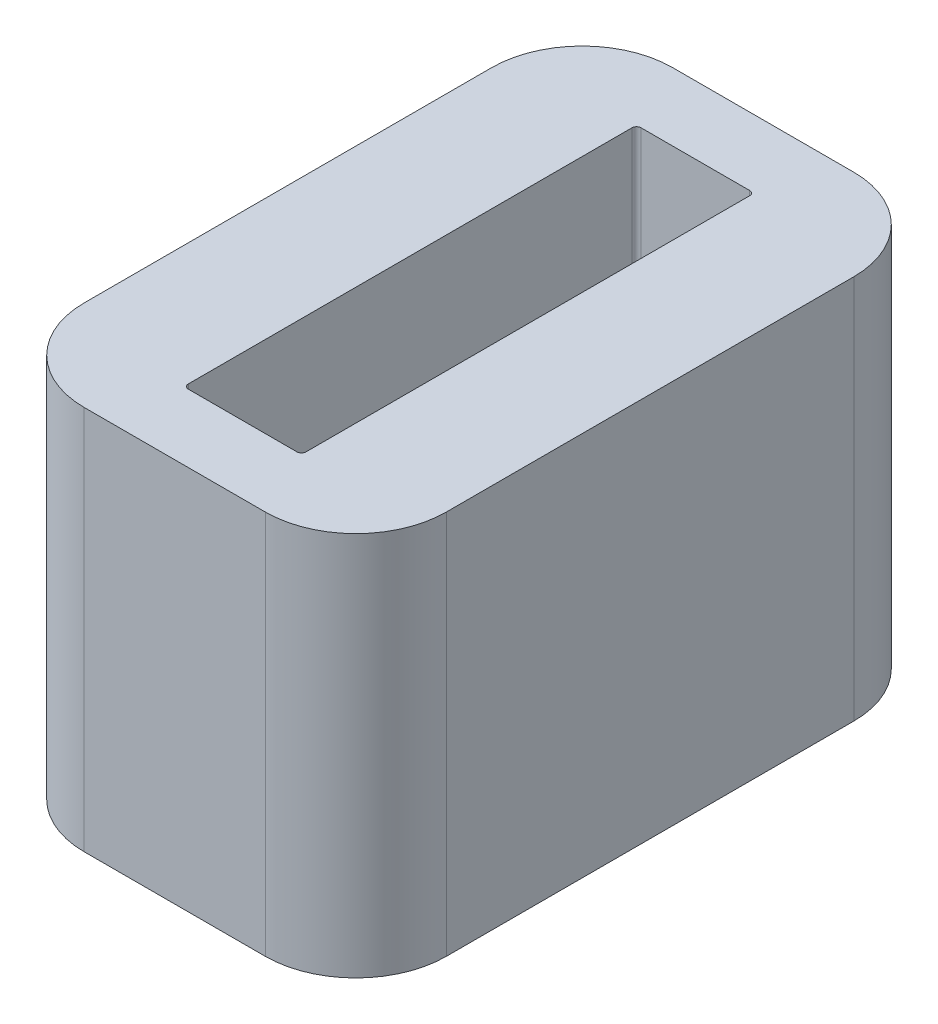
ISO-10303-21;
HEADER;
FILE_DESCRIPTION(('STEP AP214'),'2;1');
FILE_NAME('part.step','',(''),(''),'','','');
FILE_SCHEMA(('AUTOMOTIVE_DESIGN { 1 0 10303 214 1 1 1 1 }'));
ENDSEC;
DATA;
#1=APPLICATION_CONTEXT('core data for automotive mechanical design processes');
#2=APPLICATION_PROTOCOL_DEFINITION('international standard','automotive_design',2000,#1);
#3=PRODUCT_CONTEXT('',#1,'mechanical');
#4=PRODUCT('Part','Part','',(#3));
#5=PRODUCT_RELATED_PRODUCT_CATEGORY('part','',(#4));
#6=PRODUCT_DEFINITION_FORMATION('','',#4);
#7=PRODUCT_DEFINITION_CONTEXT('part definition',#1,'design');
#8=PRODUCT_DEFINITION('design','',#6,#7);
#9=PRODUCT_DEFINITION_SHAPE('','',#8);
#10=(LENGTH_UNIT() NAMED_UNIT(*) SI_UNIT(.MILLI.,.METRE.));
#11=(NAMED_UNIT(*) PLANE_ANGLE_UNIT() SI_UNIT($,.RADIAN.));
#12=(NAMED_UNIT(*) SI_UNIT($,.STERADIAN.) SOLID_ANGLE_UNIT());
#13=UNCERTAINTY_MEASURE_WITH_UNIT(LENGTH_MEASURE(1.E-05),#10,'distance_accuracy_value','');
#14=(GEOMETRIC_REPRESENTATION_CONTEXT(3) GLOBAL_UNCERTAINTY_ASSIGNED_CONTEXT((#13)) GLOBAL_UNIT_ASSIGNED_CONTEXT((#10,
#11,#12)) REPRESENTATION_CONTEXT('',''));
#15=CARTESIAN_POINT('',(0.,0.,0.));
#16=DIRECTION('',(0.,0.,1.));
#17=DIRECTION('',(1.,0.,0.));
#18=AXIS2_PLACEMENT_3D('',#15,#16,#17);
#19=CARTESIAN_POINT('',(87.0727928211845,88.0794752893805,-74.6093677585195));
#20=DIRECTION('',(0.,1.,0.));
#21=DIRECTION('',(0.,0.,1.));
#22=AXIS2_PLACEMENT_3D('',#19,#20,#21);
#23=CYLINDRICAL_SURFACE('',#22,2.);
#24=CARTESIAN_POINT('',(87.0727928211845,96.5794752893805,-74.6093677585195));
#25=DIRECTION('',(0.,1.,0.));
#26=DIRECTION('',(0.,0.,-1.));
#27=AXIS2_PLACEMENT_3D('',#24,#25,#26);
#28=CIRCLE('',#27,2.);
#29=CARTESIAN_POINT('',(85.0727928211845,96.5794752893805,-74.6093677585195));
#30=VERTEX_POINT('',#29);
#31=CARTESIAN_POINT('',(87.0727928211845,96.5794752893805,-72.6093677585195));
#32=VERTEX_POINT('',#31);
#33=EDGE_CURVE('E219',#30,#32,#28,.T.);
#34=ORIENTED_EDGE('',*,*,#33,.F.);
#35=DIRECTION('',(0.,1.,0.));
#36=VECTOR('',#35,1.);
#37=CARTESIAN_POINT('',(85.0727928211845,88.0794752893805,-74.6093677585195));
#38=LINE('',#37,#36);
#39=CARTESIAN_POINT('',(85.0727928211845,88.0794752893805,-74.6093677585195));
#40=VERTEX_POINT('',#39);
#41=EDGE_CURVE('E194',#40,#30,#38,.T.);
#42=ORIENTED_EDGE('',*,*,#41,.F.);
#43=CARTESIAN_POINT('',(87.0727928211845,88.0794752893805,-74.6093677585195));
#44=DIRECTION('',(0.,1.,0.));
#45=DIRECTION('',(0.,0.,-1.));
#46=AXIS2_PLACEMENT_3D('',#43,#44,#45);
#47=CIRCLE('',#46,2.);
#48=CARTESIAN_POINT('',(87.0727928211845,88.0794752893805,-72.6093677585195));
#49=VERTEX_POINT('',#48);
#50=EDGE_CURVE('E188',#40,#49,#47,.T.);
#51=ORIENTED_EDGE('',*,*,#50,.T.);
#52=DIRECTION('',(0.,1.,0.));
#53=VECTOR('',#52,1.);
#54=CARTESIAN_POINT('',(87.0727928211845,88.0794752893805,-72.6093677585195));
#55=LINE('',#54,#53);
#56=EDGE_CURVE('E170',#49,#32,#55,.T.);
#57=ORIENTED_EDGE('',*,*,#56,.T.);
#58=EDGE_LOOP('',(#34,#42,#51,#57));
#59=FACE_BOUND('',#58,.T.);
#60=ADVANCED_FACE('F43',(#59),#23,.T.);
#61=CARTESIAN_POINT('',(85.0727928211845,88.0794752893805,-74.6093677585195));
#62=DIRECTION('',(-1.,0.,0.));
#63=DIRECTION('',(0.,0.,1.));
#64=AXIS2_PLACEMENT_3D('',#61,#62,#63);
#65=PLANE('',#64);
#66=DIRECTION('',(0.,0.,1.));
#67=VECTOR('',#66,1.);
#68=CARTESIAN_POINT('',(85.0727928211845,96.5794752893805,-74.6093677585195));
#69=LINE('',#68,#67);
#70=CARTESIAN_POINT('',(85.0727928211845,96.5794752893805,-83.6093677585195));
#71=VERTEX_POINT('',#70);
#72=EDGE_CURVE('E195',#71,#30,#69,.T.);
#73=ORIENTED_EDGE('',*,*,#72,.F.);
#74=DIRECTION('',(0.,1.,0.));
#75=VECTOR('',#74,1.);
#76=CARTESIAN_POINT('',(85.0727928211845,88.0794752893805,-83.6093677585195));
#77=LINE('',#76,#75);
#78=CARTESIAN_POINT('',(85.0727928211845,88.0794752893805,-83.6093677585195));
#79=VERTEX_POINT('',#78);
#80=EDGE_CURVE('E244',#79,#71,#77,.T.);
#81=ORIENTED_EDGE('',*,*,#80,.F.);
#82=DIRECTION('',(0.,0.,1.));
#83=VECTOR('',#82,1.);
#84=CARTESIAN_POINT('',(85.0727928211845,88.0794752893805,-74.6093677585195));
#85=LINE('',#84,#83);
#86=EDGE_CURVE('E181',#79,#40,#85,.T.);
#87=ORIENTED_EDGE('',*,*,#86,.T.);
#88=ORIENTED_EDGE('',*,*,#41,.T.);
#89=EDGE_LOOP('',(#73,#81,#87,#88));
#90=FACE_BOUND('',#89,.T.);
#91=ADVANCED_FACE('F366',(#90),#65,.T.);
#92=CARTESIAN_POINT('',(87.0727928211845,88.0794752893805,-83.6093677585195));
#93=DIRECTION('',(0.,1.,0.));
#94=DIRECTION('',(0.,0.,1.));
#95=AXIS2_PLACEMENT_3D('',#92,#93,#94);
#96=CYLINDRICAL_SURFACE('',#95,2.00000000000001);
#97=CARTESIAN_POINT('',(87.0727928211845,96.5794752893805,-83.6093677585195));
#98=DIRECTION('',(0.,1.,0.));
#99=DIRECTION('',(0.,0.,-1.));
#100=AXIS2_PLACEMENT_3D('',#97,#98,#99);
#101=CIRCLE('',#100,2.00000000000001);
#102=CARTESIAN_POINT('',(87.0727928211845,96.5794752893805,-85.6093677585195));
#103=VERTEX_POINT('',#102);
#104=EDGE_CURVE('E199',#103,#71,#101,.T.);
#105=ORIENTED_EDGE('',*,*,#104,.F.);
#106=DIRECTION('',(0.,1.,0.));
#107=VECTOR('',#106,1.);
#108=CARTESIAN_POINT('',(87.0727928211845,88.0794752893805,-85.6093677585195));
#109=LINE('',#108,#107);
#110=CARTESIAN_POINT('',(87.0727928211845,88.0794752893805,-85.6093677585195));
#111=VERTEX_POINT('',#110);
#112=EDGE_CURVE('E247',#111,#103,#109,.T.);
#113=ORIENTED_EDGE('',*,*,#112,.F.);
#114=CARTESIAN_POINT('',(87.0727928211845,88.0794752893805,-83.6093677585195));
#115=DIRECTION('',(0.,1.,0.));
#116=DIRECTION('',(0.,0.,-1.));
#117=AXIS2_PLACEMENT_3D('',#114,#115,#116);
#118=CIRCLE('',#117,2.00000000000001);
#119=EDGE_CURVE('E215',#111,#79,#118,.T.);
#120=ORIENTED_EDGE('',*,*,#119,.T.);
#121=ORIENTED_EDGE('',*,*,#80,.T.);
#122=EDGE_LOOP('',(#105,#113,#120,#121));
#123=FACE_BOUND('',#122,.T.);
#124=ADVANCED_FACE('F371',(#123),#96,.T.);
#125=CARTESIAN_POINT('',(87.0727928211845,88.0794752893805,-85.6093677585195));
#126=DIRECTION('',(0.,0.,-1.));
#127=DIRECTION('',(-1.,0.,0.));
#128=AXIS2_PLACEMENT_3D('',#125,#126,#127);
#129=PLANE('',#128);
#130=DIRECTION('',(-1.,0.,0.));
#131=VECTOR('',#130,1.);
#132=CARTESIAN_POINT('',(87.0727928211845,96.5794752893805,-85.6093677585195));
#133=LINE('',#132,#131);
#134=CARTESIAN_POINT('',(91.0727928211845,96.5794752893805,-85.6093677585195));
#135=VERTEX_POINT('',#134);
#136=EDGE_CURVE('E235',#135,#103,#133,.T.);
#137=ORIENTED_EDGE('',*,*,#136,.F.);
#138=DIRECTION('',(0.,1.,0.));
#139=VECTOR('',#138,1.);
#140=CARTESIAN_POINT('',(91.0727928211845,88.0794752893805,-85.6093677585195));
#141=LINE('',#140,#139);
#142=CARTESIAN_POINT('',(91.0727928211845,88.0794752893805,-85.6093677585195));
#143=VERTEX_POINT('',#142);
#144=EDGE_CURVE('E250',#143,#135,#141,.T.);
#145=ORIENTED_EDGE('',*,*,#144,.F.);
#146=DIRECTION('',(-1.,0.,0.));
#147=VECTOR('',#146,1.);
#148=CARTESIAN_POINT('',(87.0727928211845,88.0794752893805,-85.6093677585195));
#149=LINE('',#148,#147);
#150=EDGE_CURVE('E212',#143,#111,#149,.T.);
#151=ORIENTED_EDGE('',*,*,#150,.T.);
#152=ORIENTED_EDGE('',*,*,#112,.T.);
#153=EDGE_LOOP('',(#137,#145,#151,#152));
#154=FACE_BOUND('',#153,.T.);
#155=ADVANCED_FACE('F479',(#154),#129,.T.);
#156=CARTESIAN_POINT('',(91.0727928211845,88.0794752893805,-83.6093677585195));
#157=DIRECTION('',(0.,1.,0.));
#158=DIRECTION('',(0.,0.,1.));
#159=AXIS2_PLACEMENT_3D('',#156,#157,#158);
#160=CYLINDRICAL_SURFACE('',#159,2.00000000000001);
#161=CARTESIAN_POINT('',(91.0727928211845,96.5794752893805,-83.6093677585195));
#162=DIRECTION('',(0.,1.,0.));
#163=DIRECTION('',(0.,0.,-1.));
#164=AXIS2_PLACEMENT_3D('',#161,#162,#163);
#165=CIRCLE('',#164,2.00000000000001);
#166=CARTESIAN_POINT('',(93.0727928211845,96.5794752893805,-83.6093677585195));
#167=VERTEX_POINT('',#166);
#168=EDGE_CURVE('E231',#167,#135,#165,.T.);
#169=ORIENTED_EDGE('',*,*,#168,.F.);
#170=DIRECTION('',(0.,1.,0.));
#171=VECTOR('',#170,1.);
#172=CARTESIAN_POINT('',(93.0727928211845,88.0794752893805,-83.6093677585195));
#173=LINE('',#172,#171);
#174=CARTESIAN_POINT('',(93.0727928211845,88.0794752893805,-83.6093677585195));
#175=VERTEX_POINT('',#174);
#176=EDGE_CURVE('E253',#175,#167,#173,.T.);
#177=ORIENTED_EDGE('',*,*,#176,.F.);
#178=CARTESIAN_POINT('',(91.0727928211845,88.0794752893805,-83.6093677585195));
#179=DIRECTION('',(0.,1.,0.));
#180=DIRECTION('',(0.,0.,-1.));
#181=AXIS2_PLACEMENT_3D('',#178,#179,#180);
#182=CIRCLE('',#181,2.00000000000001);
#183=EDGE_CURVE('E209',#175,#143,#182,.T.);
#184=ORIENTED_EDGE('',*,*,#183,.T.);
#185=ORIENTED_EDGE('',*,*,#144,.T.);
#186=EDGE_LOOP('',(#169,#177,#184,#185));
#187=FACE_BOUND('',#186,.T.);
#188=ADVANCED_FACE('F469',(#187),#160,.T.);
#189=CARTESIAN_POINT('',(93.0727928211845,88.0794752893805,-74.6093677585195));
#190=DIRECTION('',(1.,0.,0.));
#191=DIRECTION('',(0.,0.,-1.));
#192=AXIS2_PLACEMENT_3D('',#189,#190,#191);
#193=PLANE('',#192);
#194=DIRECTION('',(0.,0.,-1.));
#195=VECTOR('',#194,1.);
#196=CARTESIAN_POINT('',(93.0727928211845,96.5794752893805,-74.6093677585195));
#197=LINE('',#196,#195);
#198=CARTESIAN_POINT('',(93.0727928211845,96.5794752893805,-74.6093677585195));
#199=VERTEX_POINT('',#198);
#200=EDGE_CURVE('E227',#199,#167,#197,.T.);
#201=ORIENTED_EDGE('',*,*,#200,.F.);
#202=DIRECTION('',(0.,1.,0.));
#203=VECTOR('',#202,1.);
#204=CARTESIAN_POINT('',(93.0727928211845,88.0794752893805,-74.6093677585195));
#205=LINE('',#204,#203);
#206=CARTESIAN_POINT('',(93.0727928211845,88.0794752893805,-74.6093677585195));
#207=VERTEX_POINT('',#206);
#208=EDGE_CURVE('E256',#207,#199,#205,.T.);
#209=ORIENTED_EDGE('',*,*,#208,.F.);
#210=DIRECTION('',(0.,0.,-1.));
#211=VECTOR('',#210,1.);
#212=CARTESIAN_POINT('',(93.0727928211845,88.0794752893805,-74.6093677585195));
#213=LINE('',#212,#211);
#214=EDGE_CURVE('E206',#207,#175,#213,.T.);
#215=ORIENTED_EDGE('',*,*,#214,.T.);
#216=ORIENTED_EDGE('',*,*,#176,.T.);
#217=EDGE_LOOP('',(#201,#209,#215,#216));
#218=FACE_BOUND('',#217,.T.);
#219=ADVANCED_FACE('F460',(#218),#193,.T.);
#220=CARTESIAN_POINT('',(91.0727928211845,88.0794752893805,-74.6093677585195));
#221=DIRECTION('',(0.,1.,0.));
#222=DIRECTION('',(0.,0.,1.));
#223=AXIS2_PLACEMENT_3D('',#220,#221,#222);
#224=CYLINDRICAL_SURFACE('',#223,2.);
#225=CARTESIAN_POINT('',(91.0727928211845,96.5794752893805,-74.6093677585195));
#226=DIRECTION('',(0.,1.,0.));
#227=DIRECTION('',(0.,0.,1.));
#228=AXIS2_PLACEMENT_3D('',#225,#226,#227);
#229=CIRCLE('',#228,2.);
#230=CARTESIAN_POINT('',(91.0727928211845,96.5794752893805,-72.6093677585195));
#231=VERTEX_POINT('',#230);
#232=EDGE_CURVE('E223',#231,#199,#229,.T.);
#233=ORIENTED_EDGE('',*,*,#232,.F.);
#234=DIRECTION('',(0.,1.,0.));
#235=VECTOR('',#234,1.);
#236=CARTESIAN_POINT('',(91.0727928211845,88.0794752893805,-72.6093677585195));
#237=LINE('',#236,#235);
#238=CARTESIAN_POINT('',(91.0727928211845,88.0794752893805,-72.6093677585195));
#239=VERTEX_POINT('',#238);
#240=EDGE_CURVE('E180',#239,#231,#237,.T.);
#241=ORIENTED_EDGE('',*,*,#240,.F.);
#242=CARTESIAN_POINT('',(91.0727928211845,88.0794752893805,-74.6093677585195));
#243=DIRECTION('',(0.,1.,0.));
#244=DIRECTION('',(0.,0.,1.));
#245=AXIS2_PLACEMENT_3D('',#242,#243,#244);
#246=CIRCLE('',#245,2.);
#247=EDGE_CURVE('E192',#239,#207,#246,.T.);
#248=ORIENTED_EDGE('',*,*,#247,.T.);
#249=ORIENTED_EDGE('',*,*,#208,.T.);
#250=EDGE_LOOP('',(#233,#241,#248,#249));
#251=FACE_BOUND('',#250,.T.);
#252=ADVANCED_FACE('F452',(#251),#224,.T.);
#253=CARTESIAN_POINT('',(87.0727928211845,88.0794752893805,-72.6093677585195));
#254=DIRECTION('',(0.,0.,1.));
#255=DIRECTION('',(1.,0.,0.));
#256=AXIS2_PLACEMENT_3D('',#253,#254,#255);
#257=PLANE('',#256);
#258=DIRECTION('',(1.,0.,0.));
#259=VECTOR('',#258,1.);
#260=CARTESIAN_POINT('',(87.0727928211845,96.5794752893805,-72.6093677585195));
#261=LINE('',#260,#259);
#262=EDGE_CURVE('E175',#32,#231,#261,.T.);
#263=ORIENTED_EDGE('',*,*,#262,.F.);
#264=ORIENTED_EDGE('',*,*,#56,.F.);
#265=DIRECTION('',(1.,0.,0.));
#266=VECTOR('',#265,1.);
#267=CARTESIAN_POINT('',(87.0727928211845,88.0794752893805,-72.6093677585195));
#268=LINE('',#267,#266);
#269=EDGE_CURVE('E173',#49,#239,#268,.T.);
#270=ORIENTED_EDGE('',*,*,#269,.T.);
#271=ORIENTED_EDGE('',*,*,#240,.T.);
#272=EDGE_LOOP('',(#263,#264,#270,#271));
#273=FACE_BOUND('',#272,.T.);
#274=ADVANCED_FACE('F172',(#273),#257,.T.);
#275=CARTESIAN_POINT('',(87.0727928211845,88.0794752893805,-74.6093677585195));
#276=DIRECTION('',(0.,-1.,0.));
#277=DIRECTION('',(0.,0.,-1.));
#278=AXIS2_PLACEMENT_3D('',#275,#276,#277);
#279=PLANE('',#278);
#280=DIRECTION('',(1.,0.,0.));
#281=VECTOR('',#280,1.);
#282=CARTESIAN_POINT('',(87.7727928211845,88.0794752893805,-74.1093677585195));
#283=LINE('',#282,#281);
#284=CARTESIAN_POINT('',(87.8727928211845,88.0794752893805,-74.1093677585195));
#285=VERTEX_POINT('',#284);
#286=CARTESIAN_POINT('',(90.2727928211845,88.0794752893805,-74.1093677585195));
#287=VERTEX_POINT('',#286);
#288=EDGE_CURVE('E221',#285,#287,#283,.T.);
#289=ORIENTED_EDGE('',*,*,#288,.T.);
#290=CARTESIAN_POINT('',(90.2727928211845,88.0794752893805,-74.2093677585195));
#291=DIRECTION('',(0.,-1.,0.));
#292=DIRECTION('',(0.,0.,-1.));
#293=AXIS2_PLACEMENT_3D('',#290,#291,#292);
#294=CIRCLE('',#293,0.1);
#295=CARTESIAN_POINT('',(90.3727928211845,88.0794752893805,-74.2093677585195));
#296=VERTEX_POINT('',#295);
#297=EDGE_CURVE('E290',#287,#296,#294,.F.);
#298=ORIENTED_EDGE('',*,*,#297,.T.);
#299=DIRECTION('',(0.,0.,-1.));
#300=VECTOR('',#299,1.);
#301=CARTESIAN_POINT('',(90.3727928211845,88.0794752893805,-74.1093677585195));
#302=LINE('',#301,#300);
#303=CARTESIAN_POINT('',(90.3727928211845,88.0794752893805,-84.0093677585195));
#304=VERTEX_POINT('',#303);
#305=EDGE_CURVE('E323',#296,#304,#302,.T.);
#306=ORIENTED_EDGE('',*,*,#305,.T.);
#307=CARTESIAN_POINT('',(90.2727928211845,88.0794752893805,-84.0093677585195));
#308=DIRECTION('',(0.,-1.,0.));
#309=DIRECTION('',(0.,0.,-1.));
#310=AXIS2_PLACEMENT_3D('',#307,#308,#309);
#311=CIRCLE('',#310,0.1);
#312=CARTESIAN_POINT('',(90.2727928211845,88.0794752893805,-84.1093677585195));
#313=VERTEX_POINT('',#312);
#314=EDGE_CURVE('E11',#304,#313,#311,.F.);
#315=ORIENTED_EDGE('',*,*,#314,.T.);
#316=DIRECTION('',(-1.,0.,0.));
#317=VECTOR('',#316,1.);
#318=CARTESIAN_POINT('',(87.7727928211845,88.0794752893805,-84.1093677585195));
#319=LINE('',#318,#317);
#320=CARTESIAN_POINT('',(87.8727928211845,88.0794752893805,-84.1093677585195));
#321=VERTEX_POINT('',#320);
#322=EDGE_CURVE('E320',#313,#321,#319,.T.);
#323=ORIENTED_EDGE('',*,*,#322,.T.);
#324=CARTESIAN_POINT('',(87.8727928211845,88.0794752893805,-84.0093677585195));
#325=DIRECTION('',(0.,-1.,0.));
#326=DIRECTION('',(0.,0.,-1.));
#327=AXIS2_PLACEMENT_3D('',#324,#325,#326);
#328=CIRCLE('',#327,0.1);
#329=CARTESIAN_POINT('',(87.7727928211845,88.0794752893805,-84.0093677585195));
#330=VERTEX_POINT('',#329);
#331=EDGE_CURVE('E300',#321,#330,#328,.F.);
#332=ORIENTED_EDGE('',*,*,#331,.T.);
#333=DIRECTION('',(0.,0.,1.));
#334=VECTOR('',#333,1.);
#335=CARTESIAN_POINT('',(87.7727928211845,88.0794752893805,-74.1093677585195));
#336=LINE('',#335,#334);
#337=CARTESIAN_POINT('',(87.7727928211845,88.0794752893805,-74.2093677585195));
#338=VERTEX_POINT('',#337);
#339=EDGE_CURVE('E322',#330,#338,#336,.T.);
#340=ORIENTED_EDGE('',*,*,#339,.T.);
#341=CARTESIAN_POINT('',(87.8727928211845,88.0794752893805,-74.2093677585195));
#342=DIRECTION('',(0.,-1.,0.));
#343=DIRECTION('',(0.,0.,-1.));
#344=AXIS2_PLACEMENT_3D('',#341,#342,#343);
#345=CIRCLE('',#344,0.1);
#346=EDGE_CURVE('E295',#338,#285,#345,.F.);
#347=ORIENTED_EDGE('',*,*,#346,.T.);
#348=EDGE_LOOP('',(#289,#298,#306,#315,#323,#332,#340,#347));
#349=FACE_BOUND('',#348,.T.);
#350=ORIENTED_EDGE('',*,*,#50,.F.);
#351=ORIENTED_EDGE('',*,*,#86,.F.);
#352=ORIENTED_EDGE('',*,*,#119,.F.);
#353=ORIENTED_EDGE('',*,*,#150,.F.);
#354=ORIENTED_EDGE('',*,*,#183,.F.);
#355=ORIENTED_EDGE('',*,*,#214,.F.);
#356=ORIENTED_EDGE('',*,*,#247,.F.);
#357=ORIENTED_EDGE('',*,*,#269,.F.);
#358=EDGE_LOOP('',(#350,#351,#352,#353,#354,#355,#356,#357));
#359=FACE_BOUND('',#358,.T.);
#360=ADVANCED_FACE('F186',(#349,#359),#279,.T.);
#361=CARTESIAN_POINT('',(87.0727928211845,96.5794752893805,-74.6093677585195));
#362=DIRECTION('',(0.,-1.,0.));
#363=DIRECTION('',(0.,0.,-1.));
#364=AXIS2_PLACEMENT_3D('',#361,#362,#363);
#365=PLANE('',#364);
#366=DIRECTION('',(-1.,0.,0.));
#367=VECTOR('',#366,1.);
#368=CARTESIAN_POINT('',(87.7727928211845,96.5794752893805,-84.1093677585195));
#369=LINE('',#368,#367);
#370=CARTESIAN_POINT('',(90.2727928211845,96.5794752893805,-84.1093677585195));
#371=VERTEX_POINT('',#370);
#372=CARTESIAN_POINT('',(87.8727928211845,96.5794752893805,-84.1093677585195));
#373=VERTEX_POINT('',#372);
#374=EDGE_CURVE('E309',#371,#373,#369,.T.);
#375=ORIENTED_EDGE('',*,*,#374,.F.);
#376=CARTESIAN_POINT('',(90.2727928211845,96.5794752893805,-84.0093677585195));
#377=DIRECTION('',(0.,-1.,0.));
#378=DIRECTION('',(0.,0.,-1.));
#379=AXIS2_PLACEMENT_3D('',#376,#377,#378);
#380=CIRCLE('',#379,0.1);
#381=CARTESIAN_POINT('',(90.3727928211845,96.5794752893805,-84.0093677585195));
#382=VERTEX_POINT('',#381);
#383=EDGE_CURVE('E51',#371,#382,#380,.T.);
#384=ORIENTED_EDGE('',*,*,#383,.T.);
#385=DIRECTION('',(0.,0.,-1.));
#386=VECTOR('',#385,1.);
#387=CARTESIAN_POINT('',(90.3727928211845,96.5794752893805,-74.1093677585195));
#388=LINE('',#387,#386);
#389=CARTESIAN_POINT('',(90.3727928211845,96.5794752893805,-74.2093677585195));
#390=VERTEX_POINT('',#389);
#391=EDGE_CURVE('E308',#390,#382,#388,.T.);
#392=ORIENTED_EDGE('',*,*,#391,.F.);
#393=CARTESIAN_POINT('',(90.2727928211845,96.5794752893805,-74.2093677585195));
#394=DIRECTION('',(0.,-1.,0.));
#395=DIRECTION('',(0.,0.,-1.));
#396=AXIS2_PLACEMENT_3D('',#393,#394,#395);
#397=CIRCLE('',#396,0.1);
#398=CARTESIAN_POINT('',(90.2727928211845,96.5794752893805,-74.1093677585195));
#399=VERTEX_POINT('',#398);
#400=EDGE_CURVE('E287',#390,#399,#397,.T.);
#401=ORIENTED_EDGE('',*,*,#400,.T.);
#402=DIRECTION('',(1.,0.,0.));
#403=VECTOR('',#402,1.);
#404=CARTESIAN_POINT('',(87.7727928211845,96.5794752893805,-74.1093677585195));
#405=LINE('',#404,#403);
#406=CARTESIAN_POINT('',(87.8727928211845,96.5794752893805,-74.1093677585195));
#407=VERTEX_POINT('',#406);
#408=EDGE_CURVE('E202',#407,#399,#405,.T.);
#409=ORIENTED_EDGE('',*,*,#408,.F.);
#410=CARTESIAN_POINT('',(87.8727928211845,96.5794752893805,-74.2093677585195));
#411=DIRECTION('',(0.,-1.,0.));
#412=DIRECTION('',(0.,0.,-1.));
#413=AXIS2_PLACEMENT_3D('',#410,#411,#412);
#414=CIRCLE('',#413,0.1);
#415=CARTESIAN_POINT('',(87.7727928211845,96.5794752893805,-74.2093677585195));
#416=VERTEX_POINT('',#415);
#417=EDGE_CURVE('E292',#407,#416,#414,.T.);
#418=ORIENTED_EDGE('',*,*,#417,.T.);
#419=DIRECTION('',(0.,0.,1.));
#420=VECTOR('',#419,1.);
#421=CARTESIAN_POINT('',(87.7727928211845,96.5794752893805,-74.1093677585195));
#422=LINE('',#421,#420);
#423=CARTESIAN_POINT('',(87.7727928211845,96.5794752893805,-84.0093677585195));
#424=VERTEX_POINT('',#423);
#425=EDGE_CURVE('E332',#424,#416,#422,.T.);
#426=ORIENTED_EDGE('',*,*,#425,.F.);
#427=CARTESIAN_POINT('',(87.8727928211845,96.5794752893805,-84.0093677585195));
#428=DIRECTION('',(0.,-1.,0.));
#429=DIRECTION('',(0.,0.,-1.));
#430=AXIS2_PLACEMENT_3D('',#427,#428,#429);
#431=CIRCLE('',#430,0.1);
#432=EDGE_CURVE('E297',#424,#373,#431,.T.);
#433=ORIENTED_EDGE('',*,*,#432,.T.);
#434=EDGE_LOOP('',(#375,#384,#392,#401,#409,#418,#426,#433));
#435=FACE_BOUND('',#434,.T.);
#436=ORIENTED_EDGE('',*,*,#33,.T.);
#437=ORIENTED_EDGE('',*,*,#262,.T.);
#438=ORIENTED_EDGE('',*,*,#232,.T.);
#439=ORIENTED_EDGE('',*,*,#200,.T.);
#440=ORIENTED_EDGE('',*,*,#168,.T.);
#441=ORIENTED_EDGE('',*,*,#136,.T.);
#442=ORIENTED_EDGE('',*,*,#104,.T.);
#443=ORIENTED_EDGE('',*,*,#72,.T.);
#444=EDGE_LOOP('',(#436,#437,#438,#439,#440,#441,#442,#443));
#445=FACE_BOUND('',#444,.T.);
#446=ADVANCED_FACE('F306',(#435,#445),#365,.F.);
#447=CARTESIAN_POINT('',(90.3727928211845,88.0794752893805,-74.1093677585195));
#448=DIRECTION('',(1.,0.,0.));
#449=DIRECTION('',(0.,0.,-1.));
#450=AXIS2_PLACEMENT_3D('',#447,#448,#449);
#451=PLANE('',#450);
#452=ORIENTED_EDGE('',*,*,#305,.F.);
#453=DIRECTION('',(0.,1.,0.));
#454=VECTOR('',#453,1.);
#455=CARTESIAN_POINT('',(90.3727928211845,96.5794752893805,-74.2093677585195));
#456=LINE('',#455,#454);
#457=EDGE_CURVE('E263',#296,#390,#456,.T.);
#458=ORIENTED_EDGE('',*,*,#457,.T.);
#459=ORIENTED_EDGE('',*,*,#391,.T.);
#460=DIRECTION('',(0.,1.,0.));
#461=VECTOR('',#460,1.);
#462=CARTESIAN_POINT('',(90.3727928211845,88.0794752893805,-84.0093677585195));
#463=LINE('',#462,#461);
#464=EDGE_CURVE('E243',#382,#304,#463,.F.);
#465=ORIENTED_EDGE('',*,*,#464,.T.);
#466=EDGE_LOOP('',(#452,#458,#459,#465));
#467=FACE_BOUND('',#466,.T.);
#468=ADVANCED_FACE('F315',(#467),#451,.F.);
#469=CARTESIAN_POINT('',(87.7727928211845,88.0794752893805,-74.1093677585195));
#470=DIRECTION('',(0.,0.,1.));
#471=DIRECTION('',(1.,0.,0.));
#472=AXIS2_PLACEMENT_3D('',#469,#470,#471);
#473=PLANE('',#472);
#474=ORIENTED_EDGE('',*,*,#408,.T.);
#475=DIRECTION('',(0.,1.,0.));
#476=VECTOR('',#475,1.);
#477=CARTESIAN_POINT('',(90.2727928211845,88.0794752893805,-74.1093677585195));
#478=LINE('',#477,#476);
#479=EDGE_CURVE('E271',#399,#287,#478,.F.);
#480=ORIENTED_EDGE('',*,*,#479,.T.);
#481=ORIENTED_EDGE('',*,*,#288,.F.);
#482=DIRECTION('',(0.,1.,0.));
#483=VECTOR('',#482,1.);
#484=CARTESIAN_POINT('',(87.8727928211845,96.5794752893805,-74.1093677585195));
#485=LINE('',#484,#483);
#486=EDGE_CURVE('E267',#285,#407,#485,.T.);
#487=ORIENTED_EDGE('',*,*,#486,.T.);
#488=EDGE_LOOP('',(#474,#480,#481,#487));
#489=FACE_BOUND('',#488,.T.);
#490=ADVANCED_FACE('F343',(#489),#473,.F.);
#491=CARTESIAN_POINT('',(87.7727928211845,88.0794752893805,-74.1093677585195));
#492=DIRECTION('',(-1.,0.,0.));
#493=DIRECTION('',(0.,0.,1.));
#494=AXIS2_PLACEMENT_3D('',#491,#492,#493);
#495=PLANE('',#494);
#496=ORIENTED_EDGE('',*,*,#425,.T.);
#497=DIRECTION('',(0.,1.,0.));
#498=VECTOR('',#497,1.);
#499=CARTESIAN_POINT('',(87.7727928211845,88.0794752893805,-74.2093677585195));
#500=LINE('',#499,#498);
#501=EDGE_CURVE('E278',#416,#338,#500,.F.);
#502=ORIENTED_EDGE('',*,*,#501,.T.);
#503=ORIENTED_EDGE('',*,*,#339,.F.);
#504=DIRECTION('',(0.,1.,0.));
#505=VECTOR('',#504,1.);
#506=CARTESIAN_POINT('',(87.7727928211845,96.5794752893805,-84.0093677585195));
#507=LINE('',#506,#505);
#508=EDGE_CURVE('E274',#330,#424,#507,.T.);
#509=ORIENTED_EDGE('',*,*,#508,.T.);
#510=EDGE_LOOP('',(#496,#502,#503,#509));
#511=FACE_BOUND('',#510,.T.);
#512=ADVANCED_FACE('F356',(#511),#495,.F.);
#513=CARTESIAN_POINT('',(87.7727928211845,88.0794752893805,-84.1093677585195));
#514=DIRECTION('',(0.,0.,-1.));
#515=DIRECTION('',(-1.,0.,0.));
#516=AXIS2_PLACEMENT_3D('',#513,#514,#515);
#517=PLANE('',#516);
#518=ORIENTED_EDGE('',*,*,#374,.T.);
#519=DIRECTION('',(0.,1.,0.));
#520=VECTOR('',#519,1.);
#521=CARTESIAN_POINT('',(87.8727928211845,88.0794752893805,-84.1093677585195));
#522=LINE('',#521,#520);
#523=EDGE_CURVE('E58',#373,#321,#522,.F.);
#524=ORIENTED_EDGE('',*,*,#523,.T.);
#525=ORIENTED_EDGE('',*,*,#322,.F.);
#526=DIRECTION('',(0.,1.,0.));
#527=VECTOR('',#526,1.);
#528=CARTESIAN_POINT('',(90.2727928211845,96.5794752893805,-84.1093677585195));
#529=LINE('',#528,#527);
#530=EDGE_CURVE('E281',#313,#371,#529,.T.);
#531=ORIENTED_EDGE('',*,*,#530,.T.);
#532=EDGE_LOOP('',(#518,#524,#525,#531));
#533=FACE_BOUND('',#532,.T.);
#534=ADVANCED_FACE('F319',(#533),#517,.F.);
#535=CARTESIAN_POINT('',(90.2727928211845,88.0794752893805,-74.2093677585195));
#536=DIRECTION('',(0.,-1.,0.));
#537=DIRECTION('',(0.,0.,-1.));
#538=AXIS2_PLACEMENT_3D('',#535,#536,#537);
#539=CYLINDRICAL_SURFACE('',#538,0.1);
#540=ORIENTED_EDGE('',*,*,#297,.F.);
#541=ORIENTED_EDGE('',*,*,#479,.F.);
#542=ORIENTED_EDGE('',*,*,#400,.F.);
#543=ORIENTED_EDGE('',*,*,#457,.F.);
#544=EDGE_LOOP('',(#540,#541,#542,#543));
#545=FACE_BOUND('',#544,.T.);
#546=ADVANCED_FACE('F348',(#545),#539,.F.);
#547=CARTESIAN_POINT('',(87.8727928211845,88.0794752893805,-74.2093677585195));
#548=DIRECTION('',(0.,-1.,0.));
#549=DIRECTION('',(0.,0.,-1.));
#550=AXIS2_PLACEMENT_3D('',#547,#548,#549);
#551=CYLINDRICAL_SURFACE('',#550,0.1);
#552=ORIENTED_EDGE('',*,*,#346,.F.);
#553=ORIENTED_EDGE('',*,*,#501,.F.);
#554=ORIENTED_EDGE('',*,*,#417,.F.);
#555=ORIENTED_EDGE('',*,*,#486,.F.);
#556=EDGE_LOOP('',(#552,#553,#554,#555));
#557=FACE_BOUND('',#556,.T.);
#558=ADVANCED_FACE('F351',(#557),#551,.F.);
#559=CARTESIAN_POINT('',(87.8727928211845,88.0794752893805,-84.0093677585195));
#560=DIRECTION('',(0.,-1.,0.));
#561=DIRECTION('',(0.,0.,-1.));
#562=AXIS2_PLACEMENT_3D('',#559,#560,#561);
#563=CYLINDRICAL_SURFACE('',#562,0.1);
#564=ORIENTED_EDGE('',*,*,#331,.F.);
#565=ORIENTED_EDGE('',*,*,#523,.F.);
#566=ORIENTED_EDGE('',*,*,#432,.F.);
#567=ORIENTED_EDGE('',*,*,#508,.F.);
#568=EDGE_LOOP('',(#564,#565,#566,#567));
#569=FACE_BOUND('',#568,.T.);
#570=ADVANCED_FACE('F354',(#569),#563,.F.);
#571=CARTESIAN_POINT('',(90.2727928211845,88.0794752893805,-84.0093677585195));
#572=DIRECTION('',(0.,-1.,0.));
#573=DIRECTION('',(0.,0.,-1.));
#574=AXIS2_PLACEMENT_3D('',#571,#572,#573);
#575=CYLINDRICAL_SURFACE('',#574,0.1);
#576=ORIENTED_EDGE('',*,*,#314,.F.);
#577=ORIENTED_EDGE('',*,*,#464,.F.);
#578=ORIENTED_EDGE('',*,*,#383,.F.);
#579=ORIENTED_EDGE('',*,*,#530,.F.);
#580=EDGE_LOOP('',(#576,#577,#578,#579));
#581=FACE_BOUND('',#580,.T.);
#582=ADVANCED_FACE('F45',(#581),#575,.F.);
#583=CLOSED_SHELL('',(#60,#91,#124,#155,#188,#219,#252,#274,#360,#446,#468,#490,#512,#534,#546,
#558,#570,#582));
#584=MANIFOLD_SOLID_BREP('B2',#583);
#585=ADVANCED_BREP_SHAPE_REPRESENTATION('',(#18,#584),#14);
#586=SHAPE_DEFINITION_REPRESENTATION(#9,#585);
ENDSEC;
END-ISO-10303-21;
